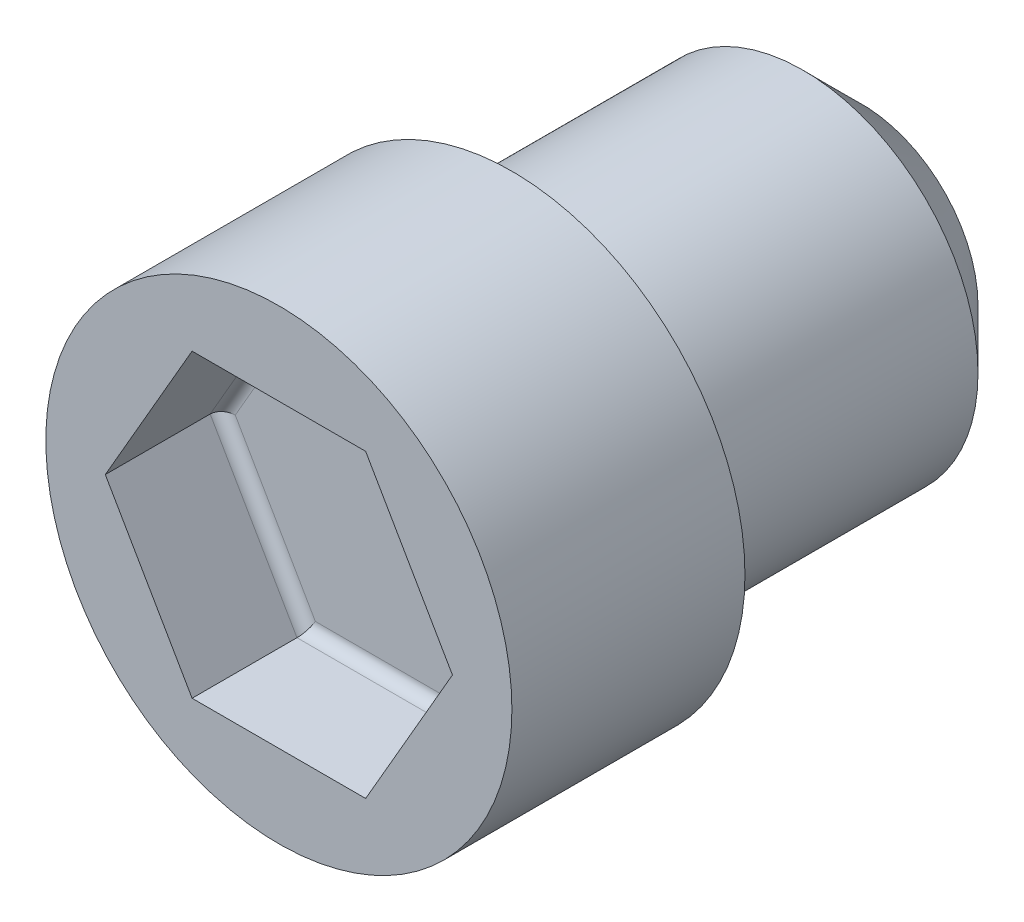
ISO-10303-21;
HEADER;
FILE_DESCRIPTION(('STEP AP214'),'2;1');
FILE_NAME('part.step','',(''),(''),'','','');
FILE_SCHEMA(('AUTOMOTIVE_DESIGN { 1 0 10303 214 1 1 1 1 }'));
ENDSEC;
DATA;
#1=APPLICATION_CONTEXT('core data for automotive mechanical design processes');
#2=APPLICATION_PROTOCOL_DEFINITION('international standard','automotive_design',2000,#1);
#3=PRODUCT_CONTEXT('',#1,'mechanical');
#4=PRODUCT('Part','Part','',(#3));
#5=PRODUCT_RELATED_PRODUCT_CATEGORY('part','',(#4));
#6=PRODUCT_DEFINITION_FORMATION('','',#4);
#7=PRODUCT_DEFINITION_CONTEXT('part definition',#1,'design');
#8=PRODUCT_DEFINITION('design','',#6,#7);
#9=PRODUCT_DEFINITION_SHAPE('','',#8);
#10=(LENGTH_UNIT() NAMED_UNIT(*) SI_UNIT(.MILLI.,.METRE.));
#11=(NAMED_UNIT(*) PLANE_ANGLE_UNIT() SI_UNIT($,.RADIAN.));
#12=(NAMED_UNIT(*) SI_UNIT($,.STERADIAN.) SOLID_ANGLE_UNIT());
#13=UNCERTAINTY_MEASURE_WITH_UNIT(LENGTH_MEASURE(1.E-05),#10,'distance_accuracy_value','');
#14=(GEOMETRIC_REPRESENTATION_CONTEXT(3) GLOBAL_UNCERTAINTY_ASSIGNED_CONTEXT((#13)) GLOBAL_UNIT_ASSIGNED_CONTEXT((#10,
#11,#12)) REPRESENTATION_CONTEXT('',''));
#15=CARTESIAN_POINT('',(0.,0.,0.));
#16=DIRECTION('',(0.,0.,1.));
#17=DIRECTION('',(1.,0.,0.));
#18=AXIS2_PLACEMENT_3D('',#15,#16,#17);
#19=CARTESIAN_POINT('',(0.,0.,3.));
#20=DIRECTION('',(0.,0.,-1.));
#21=DIRECTION('',(-1.,0.,0.));
#22=AXIS2_PLACEMENT_3D('',#19,#20,#21);
#23=CYLINDRICAL_SURFACE('',#22,1.5);
#24=CARTESIAN_POINT('',(0.,0.,0.5));
#25=DIRECTION('',(0.,0.,1.));
#26=DIRECTION('',(1.,0.,0.));
#27=AXIS2_PLACEMENT_3D('',#24,#25,#26);
#28=CIRCLE('',#27,1.5);
#29=CARTESIAN_POINT('',(1.5,0.,0.5));
#30=VERTEX_POINT('',#29);
#31=EDGE_CURVE('E166',#30,#30,#28,.T.);
#32=ORIENTED_EDGE('',*,*,#31,.T.);
#33=EDGE_LOOP('',(#32));
#34=FACE_BOUND('',#33,.T.);
#35=CARTESIAN_POINT('',(0.,0.,3.));
#36=DIRECTION('',(0.,0.,1.));
#37=DIRECTION('',(1.,0.,0.));
#38=AXIS2_PLACEMENT_3D('',#35,#36,#37);
#39=CIRCLE('',#38,1.5);
#40=CARTESIAN_POINT('',(1.5,0.,3.));
#41=VERTEX_POINT('',#40);
#42=EDGE_CURVE('E161',#41,#41,#39,.T.);
#43=ORIENTED_EDGE('',*,*,#42,.F.);
#44=EDGE_LOOP('',(#43));
#45=FACE_BOUND('',#44,.T.);
#46=ADVANCED_FACE('F41',(#34,#45),#23,.T.);
#47=CARTESIAN_POINT('',(0.,0.,0.));
#48=DIRECTION('',(0.,0.,1.));
#49=DIRECTION('',(1.,0.,0.));
#50=AXIS2_PLACEMENT_3D('',#47,#48,#49);
#51=PLANE('',#50);
#52=CARTESIAN_POINT('',(0.,0.,0.));
#53=DIRECTION('',(0.,0.,1.));
#54=DIRECTION('',(1.,0.,0.));
#55=AXIS2_PLACEMENT_3D('',#52,#53,#54);
#56=CIRCLE('',#55,0.999999999999999);
#57=CARTESIAN_POINT('',(0.999999999999999,0.,0.));
#58=VERTEX_POINT('',#57);
#59=EDGE_CURVE('E169',#58,#58,#56,.F.);
#60=ORIENTED_EDGE('',*,*,#59,.T.);
#61=EDGE_LOOP('',(#60));
#62=FACE_BOUND('',#61,.T.);
#63=ADVANCED_FACE('F254',(#62),#51,.F.);
#64=CARTESIAN_POINT('',(0.,0.,5.));
#65=DIRECTION('',(0.,0.,-1.));
#66=DIRECTION('',(-1.,0.,0.));
#67=AXIS2_PLACEMENT_3D('',#64,#65,#66);
#68=CYLINDRICAL_SURFACE('',#67,2.);
#69=CARTESIAN_POINT('',(0.,0.,5.));
#70=DIRECTION('',(0.,0.,1.));
#71=DIRECTION('',(1.,0.,0.));
#72=AXIS2_PLACEMENT_3D('',#69,#70,#71);
#73=CIRCLE('',#72,2.);
#74=CARTESIAN_POINT('',(2.,0.,5.));
#75=VERTEX_POINT('',#74);
#76=EDGE_CURVE('E158',#75,#75,#73,.T.);
#77=ORIENTED_EDGE('',*,*,#76,.F.);
#78=EDGE_LOOP('',(#77));
#79=FACE_BOUND('',#78,.T.);
#80=CARTESIAN_POINT('',(0.,0.,3.));
#81=DIRECTION('',(0.,0.,1.));
#82=DIRECTION('',(1.,0.,0.));
#83=AXIS2_PLACEMENT_3D('',#80,#81,#82);
#84=CIRCLE('',#83,2.);
#85=CARTESIAN_POINT('',(2.,0.,3.));
#86=VERTEX_POINT('',#85);
#87=EDGE_CURVE('E151',#86,#86,#84,.T.);
#88=ORIENTED_EDGE('',*,*,#87,.T.);
#89=EDGE_LOOP('',(#88));
#90=FACE_BOUND('',#89,.T.);
#91=ADVANCED_FACE('F261',(#79,#90),#68,.T.);
#92=CARTESIAN_POINT('',(0.,0.,5.));
#93=DIRECTION('',(0.,0.,1.));
#94=DIRECTION('',(1.,0.,0.));
#95=AXIS2_PLACEMENT_3D('',#92,#93,#94);
#96=PLANE('',#95);
#97=DIRECTION('',(0.5,0.866025403784439,0.));
#98=VECTOR('',#97,1.);
#99=CARTESIAN_POINT('',(0.744781847254617,-1.29,5.));
#100=LINE('',#99,#98);
#101=CARTESIAN_POINT('',(0.744781847254617,-1.29,5.));
#102=VERTEX_POINT('',#101);
#103=CARTESIAN_POINT('',(1.48956369450923,0.,5.));
#104=VERTEX_POINT('',#103);
#105=EDGE_CURVE('E132',#102,#104,#100,.T.);
#106=ORIENTED_EDGE('',*,*,#105,.F.);
#107=DIRECTION('',(1.,0.,0.));
#108=VECTOR('',#107,1.);
#109=CARTESIAN_POINT('',(-0.744781847254618,-1.29,5.));
#110=LINE('',#109,#108);
#111=CARTESIAN_POINT('',(-0.744781847254618,-1.29,5.));
#112=VERTEX_POINT('',#111);
#113=EDGE_CURVE('E146',#112,#102,#110,.T.);
#114=ORIENTED_EDGE('',*,*,#113,.F.);
#115=DIRECTION('',(0.5,-0.866025403784439,0.));
#116=VECTOR('',#115,1.);
#117=CARTESIAN_POINT('',(-1.48956369450923,0.,5.));
#118=LINE('',#117,#116);
#119=CARTESIAN_POINT('',(-1.48956369450923,0.,5.));
#120=VERTEX_POINT('',#119);
#121=EDGE_CURVE('E140',#120,#112,#118,.T.);
#122=ORIENTED_EDGE('',*,*,#121,.F.);
#123=DIRECTION('',(-0.5,-0.866025403784439,0.));
#124=VECTOR('',#123,1.);
#125=CARTESIAN_POINT('',(-0.744781847254617,1.29,5.));
#126=LINE('',#125,#124);
#127=CARTESIAN_POINT('',(-0.744781847254617,1.29,5.));
#128=VERTEX_POINT('',#127);
#129=EDGE_CURVE('E138',#128,#120,#126,.T.);
#130=ORIENTED_EDGE('',*,*,#129,.F.);
#131=DIRECTION('',(-1.,0.,0.));
#132=VECTOR('',#131,1.);
#133=CARTESIAN_POINT('',(0.744781847254616,1.29,5.));
#134=LINE('',#133,#132);
#135=CARTESIAN_POINT('',(0.744781847254616,1.29,5.));
#136=VERTEX_POINT('',#135);
#137=EDGE_CURVE('E116',#136,#128,#134,.T.);
#138=ORIENTED_EDGE('',*,*,#137,.F.);
#139=DIRECTION('',(-0.5,0.866025403784439,0.));
#140=VECTOR('',#139,1.);
#141=CARTESIAN_POINT('',(1.48956369450923,0.,5.));
#142=LINE('',#141,#140);
#143=EDGE_CURVE('E126',#104,#136,#142,.T.);
#144=ORIENTED_EDGE('',*,*,#143,.F.);
#145=EDGE_LOOP('',(#106,#114,#122,#130,#138,#144));
#146=FACE_BOUND('',#145,.T.);
#147=ORIENTED_EDGE('',*,*,#76,.T.);
#148=EDGE_LOOP('',(#147));
#149=FACE_BOUND('',#148,.T.);
#150=ADVANCED_FACE('F134',(#146,#149),#96,.T.);
#151=CARTESIAN_POINT('',(0.,0.,3.));
#152=DIRECTION('',(0.,0.,1.));
#153=DIRECTION('',(1.,0.,0.));
#154=AXIS2_PLACEMENT_3D('',#151,#152,#153);
#155=PLANE('',#154);
#156=ORIENTED_EDGE('',*,*,#42,.T.);
#157=EDGE_LOOP('',(#156));
#158=FACE_BOUND('',#157,.T.);
#159=ORIENTED_EDGE('',*,*,#87,.F.);
#160=EDGE_LOOP('',(#159));
#161=FACE_BOUND('',#160,.T.);
#162=ADVANCED_FACE('F367',(#158,#161),#155,.F.);
#163=CARTESIAN_POINT('',(0.744781847254617,-1.29,4.));
#164=DIRECTION('',(0.866025403784439,-0.5,0.));
#165=DIRECTION('',(0.5,0.866025403784439,0.));
#166=AXIS2_PLACEMENT_3D('',#163,#164,#165);
#167=PLANE('',#166);
#168=DIRECTION('',(0.,0.,1.));
#169=VECTOR('',#168,1.);
#170=CARTESIAN_POINT('',(1.48956369450923,0.,4.));
#171=LINE('',#170,#169);
#172=CARTESIAN_POINT('',(1.48956369450923,0.,4.1));
#173=VERTEX_POINT('',#172);
#174=EDGE_CURVE('E123',#173,#104,#171,.T.);
#175=ORIENTED_EDGE('',*,*,#174,.F.);
#176=DIRECTION('',(0.5,0.866025403784439,0.));
#177=VECTOR('',#176,1.);
#178=CARTESIAN_POINT('',(0.744781847254617,-1.29,4.1));
#179=LINE('',#178,#177);
#180=CARTESIAN_POINT('',(0.744781847254617,-1.29,4.1));
#181=VERTEX_POINT('',#180);
#182=EDGE_CURVE('E188',#173,#181,#179,.F.);
#183=ORIENTED_EDGE('',*,*,#182,.T.);
#184=DIRECTION('',(0.,0.,1.));
#185=VECTOR('',#184,1.);
#186=CARTESIAN_POINT('',(0.744781847254617,-1.29,4.));
#187=LINE('',#186,#185);
#188=EDGE_CURVE('E149',#181,#102,#187,.T.);
#189=ORIENTED_EDGE('',*,*,#188,.T.);
#190=ORIENTED_EDGE('',*,*,#105,.T.);
#191=EDGE_LOOP('',(#175,#183,#189,#190));
#192=FACE_BOUND('',#191,.T.);
#193=ADVANCED_FACE('F213',(#192),#167,.F.);
#194=CARTESIAN_POINT('',(-0.744781847254618,-1.29,4.));
#195=DIRECTION('',(0.,-1.,0.));
#196=DIRECTION('',(1.,0.,0.));
#197=AXIS2_PLACEMENT_3D('',#194,#195,#196);
#198=PLANE('',#197);
#199=ORIENTED_EDGE('',*,*,#188,.F.);
#200=DIRECTION('',(1.,0.,0.));
#201=VECTOR('',#200,1.);
#202=CARTESIAN_POINT('',(-0.744781847254618,-1.29,4.1));
#203=LINE('',#202,#201);
#204=CARTESIAN_POINT('',(-0.744781847254618,-1.29,4.1));
#205=VERTEX_POINT('',#204);
#206=EDGE_CURVE('E185',#181,#205,#203,.F.);
#207=ORIENTED_EDGE('',*,*,#206,.T.);
#208=DIRECTION('',(0.,0.,1.));
#209=VECTOR('',#208,1.);
#210=CARTESIAN_POINT('',(-0.744781847254618,-1.29,4.));
#211=LINE('',#210,#209);
#212=EDGE_CURVE('E152',#205,#112,#211,.T.);
#213=ORIENTED_EDGE('',*,*,#212,.T.);
#214=ORIENTED_EDGE('',*,*,#113,.T.);
#215=EDGE_LOOP('',(#199,#207,#213,#214));
#216=FACE_BOUND('',#215,.T.);
#217=ADVANCED_FACE('F218',(#216),#198,.F.);
#218=CARTESIAN_POINT('',(-1.48956369450923,0.,4.));
#219=DIRECTION('',(-0.866025403784439,-0.5,0.));
#220=DIRECTION('',(0.5,-0.866025403784439,0.));
#221=AXIS2_PLACEMENT_3D('',#218,#219,#220);
#222=PLANE('',#221);
#223=ORIENTED_EDGE('',*,*,#212,.F.);
#224=DIRECTION('',(0.5,-0.866025403784439,0.));
#225=VECTOR('',#224,1.);
#226=CARTESIAN_POINT('',(-1.48956369450923,0.,4.1));
#227=LINE('',#226,#225);
#228=CARTESIAN_POINT('',(-1.48956369450923,0.,4.1));
#229=VERTEX_POINT('',#228);
#230=EDGE_CURVE('E50',#205,#229,#227,.F.);
#231=ORIENTED_EDGE('',*,*,#230,.T.);
#232=DIRECTION('',(0.,0.,1.));
#233=VECTOR('',#232,1.);
#234=CARTESIAN_POINT('',(-1.48956369450923,0.,4.));
#235=LINE('',#234,#233);
#236=EDGE_CURVE('E154',#229,#120,#235,.T.);
#237=ORIENTED_EDGE('',*,*,#236,.T.);
#238=ORIENTED_EDGE('',*,*,#121,.T.);
#239=EDGE_LOOP('',(#223,#231,#237,#238));
#240=FACE_BOUND('',#239,.T.);
#241=ADVANCED_FACE('F220',(#240),#222,.F.);
#242=CARTESIAN_POINT('',(-0.744781847254617,1.29,4.));
#243=DIRECTION('',(-0.866025403784439,0.5,0.));
#244=DIRECTION('',(-0.5,-0.866025403784439,0.));
#245=AXIS2_PLACEMENT_3D('',#242,#243,#244);
#246=PLANE('',#245);
#247=ORIENTED_EDGE('',*,*,#236,.F.);
#248=DIRECTION('',(-0.5,-0.866025403784439,0.));
#249=VECTOR('',#248,1.);
#250=CARTESIAN_POINT('',(-0.744781847254617,1.29,4.1));
#251=LINE('',#250,#249);
#252=CARTESIAN_POINT('',(-0.744781847254617,1.29,4.1));
#253=VERTEX_POINT('',#252);
#254=EDGE_CURVE('E11',#229,#253,#251,.F.);
#255=ORIENTED_EDGE('',*,*,#254,.T.);
#256=DIRECTION('',(0.,0.,1.));
#257=VECTOR('',#256,1.);
#258=CARTESIAN_POINT('',(-0.744781847254617,1.29,4.));
#259=LINE('',#258,#257);
#260=EDGE_CURVE('E122',#253,#128,#259,.T.);
#261=ORIENTED_EDGE('',*,*,#260,.T.);
#262=ORIENTED_EDGE('',*,*,#129,.T.);
#263=EDGE_LOOP('',(#247,#255,#261,#262));
#264=FACE_BOUND('',#263,.T.);
#265=ADVANCED_FACE('F221',(#264),#246,.F.);
#266=CARTESIAN_POINT('',(0.744781847254616,1.29,4.));
#267=DIRECTION('',(0.,1.,0.));
#268=DIRECTION('',(-1.,0.,0.));
#269=AXIS2_PLACEMENT_3D('',#266,#267,#268);
#270=PLANE('',#269);
#271=ORIENTED_EDGE('',*,*,#260,.F.);
#272=DIRECTION('',(-1.,0.,0.));
#273=VECTOR('',#272,1.);
#274=CARTESIAN_POINT('',(0.744781847254616,1.29,4.1));
#275=LINE('',#274,#273);
#276=CARTESIAN_POINT('',(0.744781847254616,1.29,4.1));
#277=VERTEX_POINT('',#276);
#278=EDGE_CURVE('E119',#253,#277,#275,.F.);
#279=ORIENTED_EDGE('',*,*,#278,.T.);
#280=DIRECTION('',(0.,0.,1.));
#281=VECTOR('',#280,1.);
#282=CARTESIAN_POINT('',(0.744781847254616,1.29,4.));
#283=LINE('',#282,#281);
#284=EDGE_CURVE('E112',#277,#136,#283,.T.);
#285=ORIENTED_EDGE('',*,*,#284,.T.);
#286=ORIENTED_EDGE('',*,*,#137,.T.);
#287=EDGE_LOOP('',(#271,#279,#285,#286));
#288=FACE_BOUND('',#287,.T.);
#289=ADVANCED_FACE('F114',(#288),#270,.F.);
#290=CARTESIAN_POINT('',(1.48956369450923,0.,4.));
#291=DIRECTION('',(0.866025403784439,0.5,0.));
#292=DIRECTION('',(-0.5,0.866025403784439,0.));
#293=AXIS2_PLACEMENT_3D('',#290,#291,#292);
#294=PLANE('',#293);
#295=ORIENTED_EDGE('',*,*,#284,.F.);
#296=DIRECTION('',(-0.5,0.866025403784439,0.));
#297=VECTOR('',#296,1.);
#298=CARTESIAN_POINT('',(1.48956369450923,0.,4.1));
#299=LINE('',#298,#297);
#300=EDGE_CURVE('E190',#277,#173,#299,.F.);
#301=ORIENTED_EDGE('',*,*,#300,.T.);
#302=ORIENTED_EDGE('',*,*,#174,.T.);
#303=ORIENTED_EDGE('',*,*,#143,.T.);
#304=EDGE_LOOP('',(#295,#301,#302,#303));
#305=FACE_BOUND('',#304,.T.);
#306=ADVANCED_FACE('F127',(#305),#294,.F.);
#307=CARTESIAN_POINT('',(0.,0.,4.));
#308=DIRECTION('',(0.,0.,1.));
#309=DIRECTION('',(1.,0.,0.));
#310=AXIS2_PLACEMENT_3D('',#307,#308,#309);
#311=PLANE('',#310);
#312=DIRECTION('',(0.5,-0.866025403784439,0.));
#313=VECTOR('',#312,1.);
#314=CARTESIAN_POINT('',(-1.03057023050348,-0.595,4.));
#315=LINE('',#314,#313);
#316=CARTESIAN_POINT('',(-1.37409364067131,0.,4.));
#317=VERTEX_POINT('',#316);
#318=CARTESIAN_POINT('',(-0.687046820335655,-1.19,4.));
#319=VERTEX_POINT('',#318);
#320=EDGE_CURVE('E174',#317,#319,#315,.T.);
#321=ORIENTED_EDGE('',*,*,#320,.T.);
#322=DIRECTION('',(1.,0.,0.));
#323=VECTOR('',#322,1.);
#324=CARTESIAN_POINT('',(0.,-1.19,4.));
#325=LINE('',#324,#323);
#326=CARTESIAN_POINT('',(0.687046820335655,-1.19,4.));
#327=VERTEX_POINT('',#326);
#328=EDGE_CURVE('E182',#319,#327,#325,.T.);
#329=ORIENTED_EDGE('',*,*,#328,.T.);
#330=DIRECTION('',(0.5,0.866025403784439,0.));
#331=VECTOR('',#330,1.);
#332=CARTESIAN_POINT('',(1.03057023050348,-0.595,4.));
#333=LINE('',#332,#331);
#334=CARTESIAN_POINT('',(1.37409364067131,0.,4.));
#335=VERTEX_POINT('',#334);
#336=EDGE_CURVE('E180',#327,#335,#333,.T.);
#337=ORIENTED_EDGE('',*,*,#336,.T.);
#338=DIRECTION('',(-0.5,0.866025403784439,0.));
#339=VECTOR('',#338,1.);
#340=CARTESIAN_POINT('',(1.03057023050348,0.594999999999999,4.));
#341=LINE('',#340,#339);
#342=CARTESIAN_POINT('',(0.687046820335654,1.19,4.));
#343=VERTEX_POINT('',#342);
#344=EDGE_CURVE('E178',#335,#343,#341,.T.);
#345=ORIENTED_EDGE('',*,*,#344,.T.);
#346=DIRECTION('',(-1.,0.,0.));
#347=VECTOR('',#346,1.);
#348=CARTESIAN_POINT('',(0.,1.19,4.));
#349=LINE('',#348,#347);
#350=CARTESIAN_POINT('',(-0.687046820335655,1.19,4.));
#351=VERTEX_POINT('',#350);
#352=EDGE_CURVE('E176',#343,#351,#349,.T.);
#353=ORIENTED_EDGE('',*,*,#352,.T.);
#354=DIRECTION('',(-0.5,-0.866025403784439,0.));
#355=VECTOR('',#354,1.);
#356=CARTESIAN_POINT('',(-1.03057023050348,0.595,4.));
#357=LINE('',#356,#355);
#358=EDGE_CURVE('E172',#351,#317,#357,.T.);
#359=ORIENTED_EDGE('',*,*,#358,.T.);
#360=EDGE_LOOP('',(#321,#329,#337,#345,#353,#359));
#361=FACE_BOUND('',#360,.T.);
#362=ADVANCED_FACE('F240',(#361),#311,.T.);
#363=CARTESIAN_POINT('',(0.,0.,0.5));
#364=DIRECTION('',(0.,0.,1.));
#365=DIRECTION('',(1.,0.,0.));
#366=AXIS2_PLACEMENT_3D('',#363,#364,#365);
#367=CONICAL_SURFACE('',#366,1.5,0.78539816339745);
#368=ORIENTED_EDGE('',*,*,#59,.F.);
#369=EDGE_LOOP('',(#368));
#370=FACE_BOUND('',#369,.T.);
#371=ORIENTED_EDGE('',*,*,#31,.F.);
#372=EDGE_LOOP('',(#371));
#373=FACE_BOUND('',#372,.T.);
#374=ADVANCED_FACE('F242',(#370,#373),#367,.T.);
#375=CARTESIAN_POINT('',(0.,1.19,4.1));
#376=DIRECTION('',(-1.,0.,0.));
#377=DIRECTION('',(0.,-1.,0.));
#378=AXIS2_PLACEMENT_3D('',#375,#376,#377);
#379=CYLINDRICAL_SURFACE('',#378,0.1);
#380=CARTESIAN_POINT('',(0.687046820335654,1.19,4.1));
#381=DIRECTION('',(-0.866025403784438,0.5,0.));
#382=DIRECTION('',(0.5,0.866025403784439,0.));
#383=AXIS2_PLACEMENT_3D('',#380,#381,#382);
#384=ELLIPSE('',#383,0.115470053837925,0.1);
#385=EDGE_CURVE('E203',#277,#343,#384,.T.);
#386=ORIENTED_EDGE('',*,*,#385,.F.);
#387=ORIENTED_EDGE('',*,*,#278,.F.);
#388=CARTESIAN_POINT('',(-0.687046820335655,1.19,4.1));
#389=DIRECTION('',(-0.866025403784439,-0.5,0.));
#390=DIRECTION('',(-0.5,0.866025403784439,0.));
#391=AXIS2_PLACEMENT_3D('',#388,#389,#390);
#392=ELLIPSE('',#391,0.115470053837925,0.1);
#393=EDGE_CURVE('E45',#351,#253,#392,.F.);
#394=ORIENTED_EDGE('',*,*,#393,.F.);
#395=ORIENTED_EDGE('',*,*,#352,.F.);
#396=EDGE_LOOP('',(#386,#387,#394,#395));
#397=FACE_BOUND('',#396,.T.);
#398=ADVANCED_FACE('F43',(#397),#379,.F.);
#399=CARTESIAN_POINT('',(-1.03057023050348,0.595,4.1));
#400=DIRECTION('',(-0.5,-0.866025403784439,0.));
#401=DIRECTION('',(0.866025403784439,-0.5,0.));
#402=AXIS2_PLACEMENT_3D('',#399,#400,#401);
#403=CYLINDRICAL_SURFACE('',#402,0.1);
#404=ORIENTED_EDGE('',*,*,#393,.T.);
#405=ORIENTED_EDGE('',*,*,#254,.F.);
#406=CARTESIAN_POINT('',(-1.37409364067131,0.,4.1));
#407=DIRECTION('',(0.,-1.,0.));
#408=DIRECTION('',(1.,0.,0.));
#409=AXIS2_PLACEMENT_3D('',#406,#407,#408);
#410=ELLIPSE('',#409,0.115470053837925,0.1);
#411=EDGE_CURVE('E201',#317,#229,#410,.F.);
#412=ORIENTED_EDGE('',*,*,#411,.F.);
#413=ORIENTED_EDGE('',*,*,#358,.F.);
#414=EDGE_LOOP('',(#404,#405,#412,#413));
#415=FACE_BOUND('',#414,.T.);
#416=ADVANCED_FACE('F238',(#415),#403,.F.);
#417=CARTESIAN_POINT('',(1.03057023050348,0.595,4.1));
#418=DIRECTION('',(-0.5,0.866025403784439,0.));
#419=DIRECTION('',(-0.866025403784439,-0.5,0.));
#420=AXIS2_PLACEMENT_3D('',#417,#418,#419);
#421=CYLINDRICAL_SURFACE('',#420,0.1);
#422=ORIENTED_EDGE('',*,*,#385,.T.);
#423=ORIENTED_EDGE('',*,*,#344,.F.);
#424=CARTESIAN_POINT('',(1.37409364067131,0.,4.1));
#425=DIRECTION('',(0.,1.,0.));
#426=DIRECTION('',(1.,0.,0.));
#427=AXIS2_PLACEMENT_3D('',#424,#425,#426);
#428=ELLIPSE('',#427,0.115470053837925,0.1);
#429=EDGE_CURVE('E198',#173,#335,#428,.T.);
#430=ORIENTED_EDGE('',*,*,#429,.F.);
#431=ORIENTED_EDGE('',*,*,#300,.F.);
#432=EDGE_LOOP('',(#422,#423,#430,#431));
#433=FACE_BOUND('',#432,.T.);
#434=ADVANCED_FACE('F224',(#433),#421,.F.);
#435=CARTESIAN_POINT('',(-1.03057023050348,-0.595,4.1));
#436=DIRECTION('',(0.5,-0.866025403784439,0.));
#437=DIRECTION('',(0.866025403784439,0.5,0.));
#438=AXIS2_PLACEMENT_3D('',#435,#436,#437);
#439=CYLINDRICAL_SURFACE('',#438,0.1);
#440=ORIENTED_EDGE('',*,*,#411,.T.);
#441=ORIENTED_EDGE('',*,*,#230,.F.);
#442=CARTESIAN_POINT('',(-0.687046820335655,-1.19,4.1));
#443=DIRECTION('',(0.866025403784438,-0.5,0.));
#444=DIRECTION('',(0.5,0.866025403784439,0.));
#445=AXIS2_PLACEMENT_3D('',#442,#443,#444);
#446=ELLIPSE('',#445,0.115470053837925,0.1);
#447=EDGE_CURVE('E196',#319,#205,#446,.F.);
#448=ORIENTED_EDGE('',*,*,#447,.F.);
#449=ORIENTED_EDGE('',*,*,#320,.F.);
#450=EDGE_LOOP('',(#440,#441,#448,#449));
#451=FACE_BOUND('',#450,.T.);
#452=ADVANCED_FACE('F236',(#451),#439,.F.);
#453=CARTESIAN_POINT('',(1.03057023050348,-0.595,4.1));
#454=DIRECTION('',(0.5,0.866025403784439,0.));
#455=DIRECTION('',(-0.866025403784439,0.5,0.));
#456=AXIS2_PLACEMENT_3D('',#453,#454,#455);
#457=CYLINDRICAL_SURFACE('',#456,0.1);
#458=ORIENTED_EDGE('',*,*,#429,.T.);
#459=ORIENTED_EDGE('',*,*,#336,.F.);
#460=CARTESIAN_POINT('',(0.687046820335654,-1.19,4.1));
#461=DIRECTION('',(0.866025403784439,0.5,0.));
#462=DIRECTION('',(0.5,-0.866025403784439,0.));
#463=AXIS2_PLACEMENT_3D('',#460,#461,#462);
#464=ELLIPSE('',#463,0.115470053837925,0.1);
#465=EDGE_CURVE('E194',#181,#327,#464,.T.);
#466=ORIENTED_EDGE('',*,*,#465,.F.);
#467=ORIENTED_EDGE('',*,*,#182,.F.);
#468=EDGE_LOOP('',(#458,#459,#466,#467));
#469=FACE_BOUND('',#468,.T.);
#470=ADVANCED_FACE('F229',(#469),#457,.F.);
#471=CARTESIAN_POINT('',(0.,-1.19,4.1));
#472=DIRECTION('',(1.,0.,0.));
#473=DIRECTION('',(0.,1.,0.));
#474=AXIS2_PLACEMENT_3D('',#471,#472,#473);
#475=CYLINDRICAL_SURFACE('',#474,0.1);
#476=ORIENTED_EDGE('',*,*,#447,.T.);
#477=ORIENTED_EDGE('',*,*,#206,.F.);
#478=ORIENTED_EDGE('',*,*,#465,.T.);
#479=ORIENTED_EDGE('',*,*,#328,.F.);
#480=EDGE_LOOP('',(#476,#477,#478,#479));
#481=FACE_BOUND('',#480,.T.);
#482=ADVANCED_FACE('F232',(#481),#475,.F.);
#483=CLOSED_SHELL('',(#46,#63,#91,#150,#162,#193,#217,#241,#265,#289,#306,#362,#374,#398,#416,
#434,#452,#470,#482));
#484=MANIFOLD_SOLID_BREP('B2',#483);
#485=ADVANCED_BREP_SHAPE_REPRESENTATION('',(#18,#484),#14);
#486=SHAPE_DEFINITION_REPRESENTATION(#9,#485);
ENDSEC;
END-ISO-10303-21;
